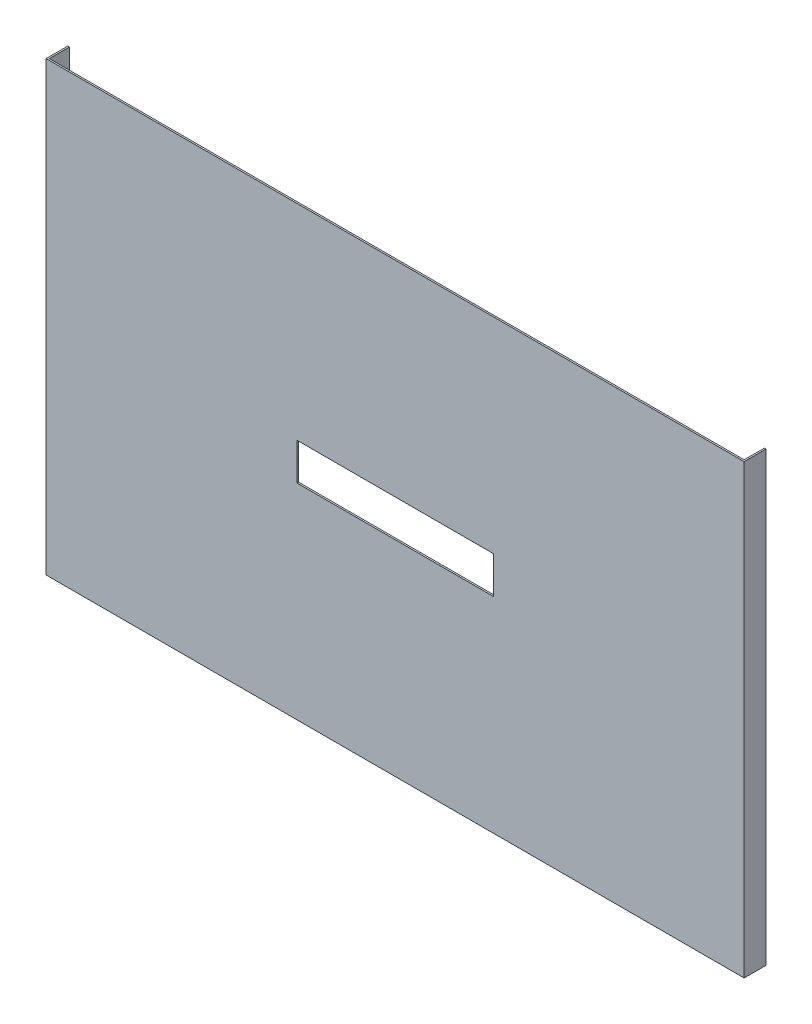
ISO-10303-21;
HEADER;
FILE_DESCRIPTION(('STEP AP214'),'2;1');
FILE_NAME('part.step','',(''),(''),'','','');
FILE_SCHEMA(('AUTOMOTIVE_DESIGN { 1 0 10303 214 1 1 1 1 }'));
ENDSEC;
DATA;
#1=APPLICATION_CONTEXT('core data for automotive mechanical design processes');
#2=APPLICATION_PROTOCOL_DEFINITION('international standard','automotive_design',2000,#1);
#3=PRODUCT_CONTEXT('',#1,'mechanical');
#4=PRODUCT('Part','Part','',(#3));
#5=PRODUCT_RELATED_PRODUCT_CATEGORY('part','',(#4));
#6=PRODUCT_DEFINITION_FORMATION('','',#4);
#7=PRODUCT_DEFINITION_CONTEXT('part definition',#1,'design');
#8=PRODUCT_DEFINITION('design','',#6,#7);
#9=PRODUCT_DEFINITION_SHAPE('','',#8);
#10=(LENGTH_UNIT() NAMED_UNIT(*) SI_UNIT(.MILLI.,.METRE.));
#11=(NAMED_UNIT(*) PLANE_ANGLE_UNIT() SI_UNIT($,.RADIAN.));
#12=(NAMED_UNIT(*) SI_UNIT($,.STERADIAN.) SOLID_ANGLE_UNIT());
#13=UNCERTAINTY_MEASURE_WITH_UNIT(LENGTH_MEASURE(1.E-05),#10,'distance_accuracy_value','');
#14=(GEOMETRIC_REPRESENTATION_CONTEXT(3) GLOBAL_UNCERTAINTY_ASSIGNED_CONTEXT((#13)) GLOBAL_UNIT_ASSIGNED_CONTEXT((#10,
#11,#12)) REPRESENTATION_CONTEXT('',''));
#15=CARTESIAN_POINT('',(0.,0.,0.));
#16=DIRECTION('',(0.,0.,1.));
#17=DIRECTION('',(1.,0.,0.));
#18=AXIS2_PLACEMENT_3D('',#15,#16,#17);
#19=CARTESIAN_POINT('',(670.,1150.,40.));
#20=DIRECTION('',(0.,0.,-1.));
#21=DIRECTION('',(-1.,0.,0.));
#22=AXIS2_PLACEMENT_3D('',#19,#20,#21);
#23=PLANE('',#22);
#24=DIRECTION('',(1.,0.,0.));
#25=VECTOR('',#24,1.);
#26=CARTESIAN_POINT('',(670.,740.,40.));
#27=LINE('',#26,#25);
#28=CARTESIAN_POINT('',(30.,740.,40.));
#29=VERTEX_POINT('',#28);
#30=CARTESIAN_POINT('',(670.,740.,40.));
#31=VERTEX_POINT('',#30);
#32=EDGE_CURVE('E141',#29,#31,#27,.T.);
#33=ORIENTED_EDGE('',*,*,#32,.T.);
#34=DIRECTION('',(0.,-1.,0.));
#35=VECTOR('',#34,1.);
#36=CARTESIAN_POINT('',(670.,1150.,40.));
#37=LINE('',#36,#35);
#38=CARTESIAN_POINT('',(670.,1150.,40.));
#39=VERTEX_POINT('',#38);
#40=EDGE_CURVE('E200',#39,#31,#37,.T.);
#41=ORIENTED_EDGE('',*,*,#40,.F.);
#42=DIRECTION('',(1.,0.,0.));
#43=VECTOR('',#42,1.);
#44=CARTESIAN_POINT('',(670.,1150.,40.));
#45=LINE('',#44,#43);
#46=CARTESIAN_POINT('',(30.,1150.,40.));
#47=VERTEX_POINT('',#46);
#48=EDGE_CURVE('E149',#47,#39,#45,.T.);
#49=ORIENTED_EDGE('',*,*,#48,.F.);
#50=DIRECTION('',(0.,-1.,0.));
#51=VECTOR('',#50,1.);
#52=CARTESIAN_POINT('',(30.,1150.,40.));
#53=LINE('',#52,#51);
#54=EDGE_CURVE('E166',#47,#29,#53,.T.);
#55=ORIENTED_EDGE('',*,*,#54,.T.);
#56=EDGE_LOOP('',(#33,#41,#49,#55));
#57=FACE_BOUND('',#56,.T.);
#58=DIRECTION('',(0.,-1.,0.));
#59=VECTOR('',#58,1.);
#60=CARTESIAN_POINT('',(260.,1150.,40.));
#61=LINE('',#60,#59);
#62=CARTESIAN_POINT('',(260.,962.,40.));
#63=VERTEX_POINT('',#62);
#64=CARTESIAN_POINT('',(260.,928.,40.));
#65=VERTEX_POINT('',#64);
#66=EDGE_CURVE('E134',#63,#65,#61,.T.);
#67=ORIENTED_EDGE('',*,*,#66,.F.);
#68=DIRECTION('',(-1.,0.,0.));
#69=VECTOR('',#68,1.);
#70=CARTESIAN_POINT('',(670.,962.,40.));
#71=LINE('',#70,#69);
#72=CARTESIAN_POINT('',(440.,962.,40.));
#73=VERTEX_POINT('',#72);
#74=EDGE_CURVE('E123',#73,#63,#71,.T.);
#75=ORIENTED_EDGE('',*,*,#74,.F.);
#76=DIRECTION('',(0.,1.,0.));
#77=VECTOR('',#76,1.);
#78=CARTESIAN_POINT('',(440.,1150.,40.));
#79=LINE('',#78,#77);
#80=CARTESIAN_POINT('',(440.,928.,40.));
#81=VERTEX_POINT('',#80);
#82=EDGE_CURVE('E128',#81,#73,#79,.T.);
#83=ORIENTED_EDGE('',*,*,#82,.F.);
#84=DIRECTION('',(1.,0.,0.));
#85=VECTOR('',#84,1.);
#86=CARTESIAN_POINT('',(670.,928.,40.));
#87=LINE('',#86,#85);
#88=EDGE_CURVE('E140',#65,#81,#87,.T.);
#89=ORIENTED_EDGE('',*,*,#88,.F.);
#90=EDGE_LOOP('',(#67,#75,#83,#89));
#91=FACE_BOUND('',#90,.T.);
#92=ADVANCED_FACE('F39',(#57,#91),#23,.F.);
#93=CARTESIAN_POINT('',(31.5,1150.,38.5));
#94=DIRECTION('',(0.,0.,1.));
#95=DIRECTION('',(1.,0.,0.));
#96=AXIS2_PLACEMENT_3D('',#93,#94,#95);
#97=PLANE('',#96);
#98=DIRECTION('',(-1.,0.,0.));
#99=VECTOR('',#98,1.);
#100=CARTESIAN_POINT('',(31.5,740.,38.5));
#101=LINE('',#100,#99);
#102=CARTESIAN_POINT('',(668.5,740.,38.5));
#103=VERTEX_POINT('',#102);
#104=CARTESIAN_POINT('',(31.5,740.,38.5));
#105=VERTEX_POINT('',#104);
#106=EDGE_CURVE('E173',#103,#105,#101,.T.);
#107=ORIENTED_EDGE('',*,*,#106,.T.);
#108=DIRECTION('',(0.,-1.,0.));
#109=VECTOR('',#108,1.);
#110=CARTESIAN_POINT('',(31.5,1150.,38.5));
#111=LINE('',#110,#109);
#112=CARTESIAN_POINT('',(31.5,1150.,38.5));
#113=VERTEX_POINT('',#112);
#114=EDGE_CURVE('E188',#113,#105,#111,.T.);
#115=ORIENTED_EDGE('',*,*,#114,.F.);
#116=DIRECTION('',(-1.,0.,0.));
#117=VECTOR('',#116,1.);
#118=CARTESIAN_POINT('',(31.5,1150.,38.5));
#119=LINE('',#118,#117);
#120=CARTESIAN_POINT('',(668.5,1150.,38.5));
#121=VERTEX_POINT('',#120);
#122=EDGE_CURVE('E159',#121,#113,#119,.T.);
#123=ORIENTED_EDGE('',*,*,#122,.F.);
#124=DIRECTION('',(0.,-1.,0.));
#125=VECTOR('',#124,1.);
#126=CARTESIAN_POINT('',(668.5,1150.,38.5));
#127=LINE('',#126,#125);
#128=EDGE_CURVE('E191',#121,#103,#127,.T.);
#129=ORIENTED_EDGE('',*,*,#128,.T.);
#130=EDGE_LOOP('',(#107,#115,#123,#129));
#131=FACE_BOUND('',#130,.T.);
#132=DIRECTION('',(0.,1.,0.));
#133=VECTOR('',#132,1.);
#134=CARTESIAN_POINT('',(260.,1150.,38.5));
#135=LINE('',#134,#133);
#136=CARTESIAN_POINT('',(260.,928.,38.5));
#137=VERTEX_POINT('',#136);
#138=CARTESIAN_POINT('',(260.,962.,38.5));
#139=VERTEX_POINT('',#138);
#140=EDGE_CURVE('E11',#137,#139,#135,.T.);
#141=ORIENTED_EDGE('',*,*,#140,.F.);
#142=DIRECTION('',(-1.,0.,0.));
#143=VECTOR('',#142,1.);
#144=CARTESIAN_POINT('',(31.5,928.,38.5));
#145=LINE('',#144,#143);
#146=CARTESIAN_POINT('',(440.,928.,38.5));
#147=VERTEX_POINT('',#146);
#148=EDGE_CURVE('E46',#147,#137,#145,.T.);
#149=ORIENTED_EDGE('',*,*,#148,.F.);
#150=DIRECTION('',(0.,-1.,0.));
#151=VECTOR('',#150,1.);
#152=CARTESIAN_POINT('',(440.,1150.,38.5));
#153=LINE('',#152,#151);
#154=CARTESIAN_POINT('',(440.,962.,38.5));
#155=VERTEX_POINT('',#154);
#156=EDGE_CURVE('E205',#155,#147,#153,.T.);
#157=ORIENTED_EDGE('',*,*,#156,.F.);
#158=DIRECTION('',(1.,0.,0.));
#159=VECTOR('',#158,1.);
#160=CARTESIAN_POINT('',(31.5,962.,38.5));
#161=LINE('',#160,#159);
#162=EDGE_CURVE('E203',#139,#155,#161,.T.);
#163=ORIENTED_EDGE('',*,*,#162,.F.);
#164=EDGE_LOOP('',(#141,#149,#157,#163));
#165=FACE_BOUND('',#164,.T.);
#166=ADVANCED_FACE('F215',(#131,#165),#97,.F.);
#167=CARTESIAN_POINT('',(670.,1150.,20.));
#168=DIRECTION('',(-1.,0.,0.));
#169=DIRECTION('',(0.,0.,1.));
#170=AXIS2_PLACEMENT_3D('',#167,#168,#169);
#171=PLANE('',#170);
#172=DIRECTION('',(0.,0.,-1.));
#173=VECTOR('',#172,1.);
#174=CARTESIAN_POINT('',(670.,740.,20.));
#175=LINE('',#174,#173);
#176=CARTESIAN_POINT('',(670.,740.,20.));
#177=VERTEX_POINT('',#176);
#178=EDGE_CURVE('E144',#31,#177,#175,.T.);
#179=ORIENTED_EDGE('',*,*,#178,.T.);
#180=DIRECTION('',(0.,-1.,0.));
#181=VECTOR('',#180,1.);
#182=CARTESIAN_POINT('',(670.,1150.,20.));
#183=LINE('',#182,#181);
#184=CARTESIAN_POINT('',(670.,1150.,20.));
#185=VERTEX_POINT('',#184);
#186=EDGE_CURVE('E197',#185,#177,#183,.T.);
#187=ORIENTED_EDGE('',*,*,#186,.F.);
#188=DIRECTION('',(0.,0.,-1.));
#189=VECTOR('',#188,1.);
#190=CARTESIAN_POINT('',(670.,1150.,20.));
#191=LINE('',#190,#189);
#192=EDGE_CURVE('E152',#39,#185,#191,.T.);
#193=ORIENTED_EDGE('',*,*,#192,.F.);
#194=ORIENTED_EDGE('',*,*,#40,.T.);
#195=EDGE_LOOP('',(#179,#187,#193,#194));
#196=FACE_BOUND('',#195,.T.);
#197=ADVANCED_FACE('F234',(#196),#171,.F.);
#198=CARTESIAN_POINT('',(668.5,1150.,20.));
#199=DIRECTION('',(0.,0.,1.));
#200=DIRECTION('',(1.,0.,0.));
#201=AXIS2_PLACEMENT_3D('',#198,#199,#200);
#202=PLANE('',#201);
#203=DIRECTION('',(-1.,0.,0.));
#204=VECTOR('',#203,1.);
#205=CARTESIAN_POINT('',(668.5,740.,20.));
#206=LINE('',#205,#204);
#207=CARTESIAN_POINT('',(668.5,740.,20.));
#208=VERTEX_POINT('',#207);
#209=EDGE_CURVE('E169',#177,#208,#206,.T.);
#210=ORIENTED_EDGE('',*,*,#209,.T.);
#211=DIRECTION('',(0.,-1.,0.));
#212=VECTOR('',#211,1.);
#213=CARTESIAN_POINT('',(668.5,1150.,20.));
#214=LINE('',#213,#212);
#215=CARTESIAN_POINT('',(668.5,1150.,20.));
#216=VERTEX_POINT('',#215);
#217=EDGE_CURVE('E194',#216,#208,#214,.T.);
#218=ORIENTED_EDGE('',*,*,#217,.F.);
#219=DIRECTION('',(-1.,0.,0.));
#220=VECTOR('',#219,1.);
#221=CARTESIAN_POINT('',(668.5,1150.,20.));
#222=LINE('',#221,#220);
#223=EDGE_CURVE('E155',#185,#216,#222,.T.);
#224=ORIENTED_EDGE('',*,*,#223,.F.);
#225=ORIENTED_EDGE('',*,*,#186,.T.);
#226=EDGE_LOOP('',(#210,#218,#224,#225));
#227=FACE_BOUND('',#226,.T.);
#228=ADVANCED_FACE('F273',(#227),#202,.F.);
#229=CARTESIAN_POINT('',(668.5,1150.,38.5));
#230=DIRECTION('',(1.,0.,0.));
#231=DIRECTION('',(0.,0.,-1.));
#232=AXIS2_PLACEMENT_3D('',#229,#230,#231);
#233=PLANE('',#232);
#234=DIRECTION('',(0.,0.,1.));
#235=VECTOR('',#234,1.);
#236=CARTESIAN_POINT('',(668.5,740.,38.5));
#237=LINE('',#236,#235);
#238=EDGE_CURVE('E171',#208,#103,#237,.T.);
#239=ORIENTED_EDGE('',*,*,#238,.T.);
#240=ORIENTED_EDGE('',*,*,#128,.F.);
#241=DIRECTION('',(0.,0.,1.));
#242=VECTOR('',#241,1.);
#243=CARTESIAN_POINT('',(668.5,1150.,38.5));
#244=LINE('',#243,#242);
#245=EDGE_CURVE('E157',#216,#121,#244,.T.);
#246=ORIENTED_EDGE('',*,*,#245,.F.);
#247=ORIENTED_EDGE('',*,*,#217,.T.);
#248=EDGE_LOOP('',(#239,#240,#246,#247));
#249=FACE_BOUND('',#248,.T.);
#250=ADVANCED_FACE('F270',(#249),#233,.F.);
#251=CARTESIAN_POINT('',(31.5,1150.,20.));
#252=DIRECTION('',(-1.,0.,0.));
#253=DIRECTION('',(0.,0.,1.));
#254=AXIS2_PLACEMENT_3D('',#251,#252,#253);
#255=PLANE('',#254);
#256=DIRECTION('',(0.,0.,-1.));
#257=VECTOR('',#256,1.);
#258=CARTESIAN_POINT('',(31.5,740.,20.));
#259=LINE('',#258,#257);
#260=CARTESIAN_POINT('',(31.5,740.,20.));
#261=VERTEX_POINT('',#260);
#262=EDGE_CURVE('E175',#105,#261,#259,.T.);
#263=ORIENTED_EDGE('',*,*,#262,.T.);
#264=DIRECTION('',(0.,-1.,0.));
#265=VECTOR('',#264,1.);
#266=CARTESIAN_POINT('',(31.5,1150.,20.));
#267=LINE('',#266,#265);
#268=CARTESIAN_POINT('',(31.5,1150.,20.));
#269=VERTEX_POINT('',#268);
#270=EDGE_CURVE('E185',#269,#261,#267,.T.);
#271=ORIENTED_EDGE('',*,*,#270,.F.);
#272=DIRECTION('',(0.,0.,-1.));
#273=VECTOR('',#272,1.);
#274=CARTESIAN_POINT('',(31.5,1150.,20.));
#275=LINE('',#274,#273);
#276=EDGE_CURVE('E161',#113,#269,#275,.T.);
#277=ORIENTED_EDGE('',*,*,#276,.F.);
#278=ORIENTED_EDGE('',*,*,#114,.T.);
#279=EDGE_LOOP('',(#263,#271,#277,#278));
#280=FACE_BOUND('',#279,.T.);
#281=ADVANCED_FACE('F263',(#280),#255,.F.);
#282=CARTESIAN_POINT('',(30.,1150.,20.));
#283=DIRECTION('',(0.,0.,1.));
#284=DIRECTION('',(1.,0.,0.));
#285=AXIS2_PLACEMENT_3D('',#282,#283,#284);
#286=PLANE('',#285);
#287=DIRECTION('',(-1.,0.,0.));
#288=VECTOR('',#287,1.);
#289=CARTESIAN_POINT('',(30.,740.,20.));
#290=LINE('',#289,#288);
#291=CARTESIAN_POINT('',(30.,740.,20.));
#292=VERTEX_POINT('',#291);
#293=EDGE_CURVE('E177',#261,#292,#290,.T.);
#294=ORIENTED_EDGE('',*,*,#293,.T.);
#295=DIRECTION('',(0.,-1.,0.));
#296=VECTOR('',#295,1.);
#297=CARTESIAN_POINT('',(30.,1150.,20.));
#298=LINE('',#297,#296);
#299=CARTESIAN_POINT('',(30.,1150.,20.));
#300=VERTEX_POINT('',#299);
#301=EDGE_CURVE('E182',#300,#292,#298,.T.);
#302=ORIENTED_EDGE('',*,*,#301,.F.);
#303=DIRECTION('',(-1.,0.,0.));
#304=VECTOR('',#303,1.);
#305=CARTESIAN_POINT('',(30.,1150.,20.));
#306=LINE('',#305,#304);
#307=EDGE_CURVE('E163',#269,#300,#306,.T.);
#308=ORIENTED_EDGE('',*,*,#307,.F.);
#309=ORIENTED_EDGE('',*,*,#270,.T.);
#310=EDGE_LOOP('',(#294,#302,#308,#309));
#311=FACE_BOUND('',#310,.T.);
#312=ADVANCED_FACE('F258',(#311),#286,.F.);
#313=CARTESIAN_POINT('',(30.,1150.,40.));
#314=DIRECTION('',(1.,0.,0.));
#315=DIRECTION('',(0.,0.,-1.));
#316=AXIS2_PLACEMENT_3D('',#313,#314,#315);
#317=PLANE('',#316);
#318=DIRECTION('',(0.,0.,1.));
#319=VECTOR('',#318,1.);
#320=CARTESIAN_POINT('',(30.,740.,40.));
#321=LINE('',#320,#319);
#322=EDGE_CURVE('E153',#292,#29,#321,.T.);
#323=ORIENTED_EDGE('',*,*,#322,.T.);
#324=ORIENTED_EDGE('',*,*,#54,.F.);
#325=DIRECTION('',(0.,0.,1.));
#326=VECTOR('',#325,1.);
#327=CARTESIAN_POINT('',(30.,1150.,40.));
#328=LINE('',#327,#326);
#329=EDGE_CURVE('E165',#300,#47,#328,.T.);
#330=ORIENTED_EDGE('',*,*,#329,.F.);
#331=ORIENTED_EDGE('',*,*,#301,.T.);
#332=EDGE_LOOP('',(#323,#324,#330,#331));
#333=FACE_BOUND('',#332,.T.);
#334=ADVANCED_FACE('F256',(#333),#317,.F.);
#335=CARTESIAN_POINT('',(0.,1150.,0.));
#336=DIRECTION('',(0.,-1.,0.));
#337=DIRECTION('',(0.,0.,-1.));
#338=AXIS2_PLACEMENT_3D('',#335,#336,#337);
#339=PLANE('',#338);
#340=ORIENTED_EDGE('',*,*,#48,.T.);
#341=ORIENTED_EDGE('',*,*,#192,.T.);
#342=ORIENTED_EDGE('',*,*,#223,.T.);
#343=ORIENTED_EDGE('',*,*,#245,.T.);
#344=ORIENTED_EDGE('',*,*,#122,.T.);
#345=ORIENTED_EDGE('',*,*,#276,.T.);
#346=ORIENTED_EDGE('',*,*,#307,.T.);
#347=ORIENTED_EDGE('',*,*,#329,.T.);
#348=EDGE_LOOP('',(#340,#341,#342,#343,#344,#345,#346,#347));
#349=FACE_BOUND('',#348,.T.);
#350=ADVANCED_FACE('F251',(#349),#339,.F.);
#351=CARTESIAN_POINT('',(0.,740.,0.));
#352=DIRECTION('',(0.,-1.,0.));
#353=DIRECTION('',(0.,0.,-1.));
#354=AXIS2_PLACEMENT_3D('',#351,#352,#353);
#355=PLANE('',#354);
#356=ORIENTED_EDGE('',*,*,#32,.F.);
#357=ORIENTED_EDGE('',*,*,#322,.F.);
#358=ORIENTED_EDGE('',*,*,#293,.F.);
#359=ORIENTED_EDGE('',*,*,#262,.F.);
#360=ORIENTED_EDGE('',*,*,#106,.F.);
#361=ORIENTED_EDGE('',*,*,#238,.F.);
#362=ORIENTED_EDGE('',*,*,#209,.F.);
#363=ORIENTED_EDGE('',*,*,#178,.F.);
#364=EDGE_LOOP('',(#356,#357,#358,#359,#360,#361,#362,#363));
#365=FACE_BOUND('',#364,.T.);
#366=ADVANCED_FACE('F243',(#365),#355,.T.);
#367=CARTESIAN_POINT('',(260.,928.,41.));
#368=DIRECTION('',(1.,0.,0.));
#369=DIRECTION('',(0.,0.,-1.));
#370=AXIS2_PLACEMENT_3D('',#367,#368,#369);
#371=PLANE('',#370);
#372=ORIENTED_EDGE('',*,*,#66,.T.);
#373=DIRECTION('',(0.,0.,-1.));
#374=VECTOR('',#373,1.);
#375=CARTESIAN_POINT('',(260.,928.,41.));
#376=LINE('',#375,#374);
#377=EDGE_CURVE('E129',#65,#137,#376,.T.);
#378=ORIENTED_EDGE('',*,*,#377,.T.);
#379=ORIENTED_EDGE('',*,*,#140,.T.);
#380=DIRECTION('',(0.,0.,-1.));
#381=VECTOR('',#380,1.);
#382=CARTESIAN_POINT('',(260.,962.,41.));
#383=LINE('',#382,#381);
#384=EDGE_CURVE('E58',#63,#139,#383,.T.);
#385=ORIENTED_EDGE('',*,*,#384,.F.);
#386=EDGE_LOOP('',(#372,#378,#379,#385));
#387=FACE_BOUND('',#386,.T.);
#388=ADVANCED_FACE('F132',(#387),#371,.T.);
#389=CARTESIAN_POINT('',(260.,928.,41.));
#390=DIRECTION('',(0.,1.,0.));
#391=DIRECTION('',(0.,0.,1.));
#392=AXIS2_PLACEMENT_3D('',#389,#390,#391);
#393=PLANE('',#392);
#394=ORIENTED_EDGE('',*,*,#88,.T.);
#395=DIRECTION('',(0.,0.,-1.));
#396=VECTOR('',#395,1.);
#397=CARTESIAN_POINT('',(440.,928.,41.));
#398=LINE('',#397,#396);
#399=EDGE_CURVE('E211',#81,#147,#398,.T.);
#400=ORIENTED_EDGE('',*,*,#399,.T.);
#401=ORIENTED_EDGE('',*,*,#148,.T.);
#402=ORIENTED_EDGE('',*,*,#377,.F.);
#403=EDGE_LOOP('',(#394,#400,#401,#402));
#404=FACE_BOUND('',#403,.T.);
#405=ADVANCED_FACE('F209',(#404),#393,.T.);
#406=CARTESIAN_POINT('',(440.,928.,41.));
#407=DIRECTION('',(-1.,0.,0.));
#408=DIRECTION('',(0.,0.,1.));
#409=AXIS2_PLACEMENT_3D('',#406,#407,#408);
#410=PLANE('',#409);
#411=ORIENTED_EDGE('',*,*,#82,.T.);
#412=DIRECTION('',(0.,0.,-1.));
#413=VECTOR('',#412,1.);
#414=CARTESIAN_POINT('',(440.,962.,41.));
#415=LINE('',#414,#413);
#416=EDGE_CURVE('E53',#73,#155,#415,.T.);
#417=ORIENTED_EDGE('',*,*,#416,.T.);
#418=ORIENTED_EDGE('',*,*,#156,.T.);
#419=ORIENTED_EDGE('',*,*,#399,.F.);
#420=EDGE_LOOP('',(#411,#417,#418,#419));
#421=FACE_BOUND('',#420,.T.);
#422=ADVANCED_FACE('F217',(#421),#410,.T.);
#423=CARTESIAN_POINT('',(260.,962.,41.));
#424=DIRECTION('',(0.,-1.,0.));
#425=DIRECTION('',(0.,0.,-1.));
#426=AXIS2_PLACEMENT_3D('',#423,#424,#425);
#427=PLANE('',#426);
#428=ORIENTED_EDGE('',*,*,#74,.T.);
#429=ORIENTED_EDGE('',*,*,#384,.T.);
#430=ORIENTED_EDGE('',*,*,#162,.T.);
#431=ORIENTED_EDGE('',*,*,#416,.F.);
#432=EDGE_LOOP('',(#428,#429,#430,#431));
#433=FACE_BOUND('',#432,.T.);
#434=ADVANCED_FACE('F124',(#433),#427,.T.);
#435=CLOSED_SHELL('',(#92,#166,#197,#228,#250,#281,#312,#334,#350,#366,#388,#405,#422,#434));
#436=MANIFOLD_SOLID_BREP('B2',#435);
#437=ADVANCED_BREP_SHAPE_REPRESENTATION('',(#18,#436),#14);
#438=SHAPE_DEFINITION_REPRESENTATION(#9,#437);
ENDSEC;
END-ISO-10303-21;
